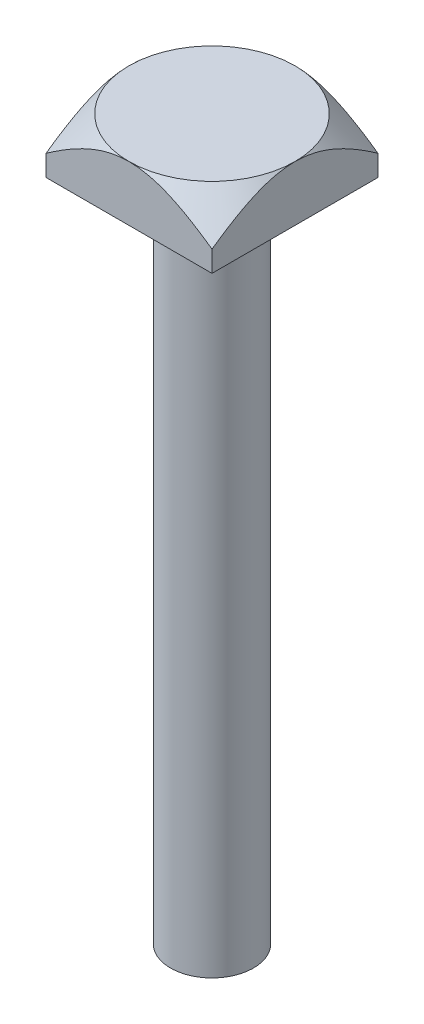
ISO-10303-21;
HEADER;
FILE_DESCRIPTION(('STEP AP214'),'2;1');
FILE_NAME('part.step','',(''),(''),'','','');
FILE_SCHEMA(('AUTOMOTIVE_DESIGN { 1 0 10303 214 1 1 1 1 }'));
ENDSEC;
DATA;
#1=APPLICATION_CONTEXT('core data for automotive mechanical design processes');
#2=APPLICATION_PROTOCOL_DEFINITION('international standard','automotive_design',2000,#1);
#3=PRODUCT_CONTEXT('',#1,'mechanical');
#4=PRODUCT('Part','Part','',(#3));
#5=PRODUCT_RELATED_PRODUCT_CATEGORY('part','',(#4));
#6=PRODUCT_DEFINITION_FORMATION('','',#4);
#7=PRODUCT_DEFINITION_CONTEXT('part definition',#1,'design');
#8=PRODUCT_DEFINITION('design','',#6,#7);
#9=PRODUCT_DEFINITION_SHAPE('','',#8);
#10=(LENGTH_UNIT() NAMED_UNIT(*) SI_UNIT(.MILLI.,.METRE.));
#11=(NAMED_UNIT(*) PLANE_ANGLE_UNIT() SI_UNIT($,.RADIAN.));
#12=(NAMED_UNIT(*) SI_UNIT($,.STERADIAN.) SOLID_ANGLE_UNIT());
#13=UNCERTAINTY_MEASURE_WITH_UNIT(LENGTH_MEASURE(1.E-05),#10,'distance_accuracy_value','');
#14=(GEOMETRIC_REPRESENTATION_CONTEXT(3) GLOBAL_UNCERTAINTY_ASSIGNED_CONTEXT((#13)) GLOBAL_UNIT_ASSIGNED_CONTEXT((#10,
#11,#12)) REPRESENTATION_CONTEXT('',''));
#15=CARTESIAN_POINT('',(0.,0.,0.));
#16=DIRECTION('',(0.,0.,1.));
#17=DIRECTION('',(1.,0.,0.));
#18=AXIS2_PLACEMENT_3D('',#15,#16,#17);
#19=CARTESIAN_POINT('',(12.,8.00000000000012,-12.0000000000002));
#20=DIRECTION('',(-1.,0.,0.));
#21=DIRECTION('',(0.,0.,1.));
#22=AXIS2_PLACEMENT_3D('',#19,#20,#21);
#23=PLANE('',#22);
#24=CARTESIAN_POINT('',(12.,-19.1812739721519,37.2984212813467));
#25=CARTESIAN_POINT('',(12.,-18.5627629114545,36.6486656358265));
#26=CARTESIAN_POINT('',(12.,-17.9450254734401,35.9981717990548));
#27=CARTESIAN_POINT('',(12.,-16.7114099467519,34.6954159558372));
#28=CARTESIAN_POINT('',(12.,-16.0955318698128,34.0431539382812));
#29=CARTESIAN_POINT('',(12.,-14.8657206457217,32.736329127349));
#30=CARTESIAN_POINT('',(12.,-14.2517883293344,32.0817655518025));
#31=CARTESIAN_POINT('',(12.,-13.0265223581445,30.77021205401));
#32=CARTESIAN_POINT('',(12.,-12.4151886982393,30.1132221365329));
#33=CARTESIAN_POINT('',(12.,-11.1887656819335,28.7889257123004));
#34=CARTESIAN_POINT('',(12.,-10.5737117131069,28.1215864138261));
#35=CARTESIAN_POINT('',(12.,-9.3474957620893,26.7833414641541));
#36=CARTESIAN_POINT('',(12.,-8.73633377118265,26.1124358209489));
#37=CARTESIAN_POINT('',(12.,-7.51898164675685,24.7664449918276));
#38=CARTESIAN_POINT('',(12.,-6.91279025143004,24.0913609481095));
#39=CARTESIAN_POINT('',(12.,-5.70645017231661,22.7358155925826));
#40=CARTESIAN_POINT('',(12.,-5.10630143818861,22.0553543256558));
#41=CARTESIAN_POINT('',(12.,-4.07105625484531,20.8680706021514));
#42=CARTESIAN_POINT('',(12.,-3.63418453883629,20.3627969410216));
#43=CARTESIAN_POINT('',(12.,-2.76556538016205,19.3478665203994));
#44=CARTESIAN_POINT('',(12.,-2.33381788605035,18.8382098050011));
#45=CARTESIAN_POINT('',(12.,-1.47633941592013,17.8132551439981));
#46=CARTESIAN_POINT('',(12.,-1.05061278509641,17.297953557375));
#47=CARTESIAN_POINT('',(12.,-0.207082192100009,16.2609110663221));
#48=CARTESIAN_POINT('',(12.,0.210721968042881,15.739170323336));
#49=CARTESIAN_POINT('',(12.,1.03533071759846,14.6889159257799));
#50=CARTESIAN_POINT('',(12.,1.44215761041748,14.1604198222624));
#51=CARTESIAN_POINT('',(12.,2.2428569645836,13.0935370738698));
#52=CARTESIAN_POINT('',(12.,2.63672781843961,12.5551492145167));
#53=CARTESIAN_POINT('',(12.,3.21431301331167,11.7386554398023));
#54=CARTESIAN_POINT('',(12.,3.40454031730682,11.4651532171146));
#55=CARTESIAN_POINT('',(12.,3.77994239368811,10.9147077060796));
#56=CARTESIAN_POINT('',(12.,3.96511733158044,10.6377645308851));
#57=CARTESIAN_POINT('',(12.,4.32952966306028,10.0800878964703));
#58=CARTESIAN_POINT('',(12.,4.50876849161502,9.79935537670839));
#59=CARTESIAN_POINT('',(12.,4.86031303388038,9.23359412121878));
#60=CARTESIAN_POINT('',(12.,5.0326192093632,8.94856567337966));
#61=CARTESIAN_POINT('',(12.,5.32630806967851,8.44674144412769));
#62=CARTESIAN_POINT('',(12.,5.44950596054363,8.23100943203479));
#63=CARTESIAN_POINT('',(12.,5.69071890443423,7.79667352106897));
#64=CARTESIAN_POINT('',(12.,5.80873397279543,7.57806963069629));
#65=CARTESIAN_POINT('',(12.,6.15402918913923,6.91752048325592));
#66=CARTESIAN_POINT('',(12.,6.37252289395979,6.47089925404572));
#67=CARTESIAN_POINT('',(12.,6.77841217286116,5.56539128738989));
#68=CARTESIAN_POINT('',(12.,6.96590895781203,5.10655038618981));
#69=CARTESIAN_POINT('',(12.,7.30195606932974,4.17476260034244));
#70=CARTESIAN_POINT('',(12.,7.45052690700111,3.70182329143847));
#71=CARTESIAN_POINT('',(12.,7.66490988261879,2.87523617724904));
#72=CARTESIAN_POINT('',(12.,7.74224524281219,2.52458411956688));
#73=CARTESIAN_POINT('',(12.,7.86802442929361,1.81810462323864));
#74=CARTESIAN_POINT('',(12.,7.91647303453478,1.46227805063503));
#75=CARTESIAN_POINT('',(12.,7.98193080100035,0.748364005245253));
#76=CARTESIAN_POINT('',(12.,7.99899759504462,0.390281891294811));
#77=CARTESIAN_POINT('',(12.,8.00091626695557,-0.32598079396727));
#78=CARTESIAN_POINT('',(12.,7.98576731555725,-0.68416136757606));
#79=CARTESIAN_POINT('',(12.,7.92419561610344,-1.39667661734302));
#80=CARTESIAN_POINT('',(12.,7.87786862012115,-1.75101970346653));
#81=CARTESIAN_POINT('',(12.,7.75641750434346,-2.45469220771016));
#82=CARTESIAN_POINT('',(12.,7.68129109567725,-2.80402122504073));
#83=CARTESIAN_POINT('',(12.,7.50532009532147,-3.49711086244222));
#84=CARTESIAN_POINT('',(12.,7.4044035542097,-3.84085299519655));
#85=CARTESIAN_POINT('',(12.,7.18062473632253,-4.52101205003485));
#86=CARTESIAN_POINT('',(12.,7.05776357927666,-4.85742934488836));
#87=CARTESIAN_POINT('',(12.,6.74210230584215,-5.65262808025449));
#88=CARTESIAN_POINT('',(12.,6.54070880983129,-6.1079860978865));
#89=CARTESIAN_POINT('',(12.,6.11033067411179,-7.00558097748064));
#90=CARTESIAN_POINT('',(12.,5.88133016315717,-7.44781010785268));
#91=CARTESIAN_POINT('',(12.,5.40160277209869,-8.32146195015965));
#92=CARTESIAN_POINT('',(12.,5.15083053558319,-8.7528595657704));
#93=CARTESIAN_POINT('',(12.,4.63281404272941,-9.60546647465652));
#94=CARTESIAN_POINT('',(12.,4.36557291373857,-10.0266776812481));
#95=CARTESIAN_POINT('',(12.,3.81455880627808,-10.8660012567581));
#96=CARTESIAN_POINT('',(12.,3.53061547251958,-11.2840012658661));
#97=CARTESIAN_POINT('',(12.,2.95218591759066,-12.1126353013767));
#98=CARTESIAN_POINT('',(12.,2.65769932097938,-12.5232690646876));
#99=CARTESIAN_POINT('',(12.,2.06065278764246,-13.3377958424883));
#100=CARTESIAN_POINT('',(12.,1.7581037201065,-13.7416968463823));
#101=CARTESIAN_POINT('',(12.,1.14614768516503,-14.5442460194562));
#102=CARTESIAN_POINT('',(12.,0.83674083903096,-14.9428942813259));
#103=CARTESIAN_POINT('',(12.,0.132118508441443,-15.8375201521696));
#104=CARTESIAN_POINT('',(12.,-0.264732312596434,-16.332208309009));
#105=CARTESIAN_POINT('',(12.,-1.06552270926232,-17.3158225423199));
#106=CARTESIAN_POINT('',(12.,-1.46946249261457,-17.8047484492392));
#107=CARTESIAN_POINT('',(12.,-2.28310500708682,-18.777858932031));
#108=CARTESIAN_POINT('',(12.,-2.69280831826991,-19.2620430222302));
#109=CARTESIAN_POINT('',(12.,-3.51690429630569,-20.2264051610384));
#110=CARTESIAN_POINT('',(12.,-3.93129699898356,-20.7065831789937));
#111=CARTESIAN_POINT('',(12.,-4.76437681199456,-21.6640274841358));
#112=CARTESIAN_POINT('',(12.,-5.18306774918477,-22.1412904385852));
#113=CARTESIAN_POINT('',(12.,-6.02371597926371,-23.0929300124391));
#114=CARTESIAN_POINT('',(12.,-6.44567327903462,-23.5673066257584));
#115=CARTESIAN_POINT('',(12.,-7.71561245140312,-24.9866862419157));
#116=CARTESIAN_POINT('',(12.,-8.56771632140692,-25.9280016336962));
#117=CARTESIAN_POINT('',(12.,-10.2272153194572,-27.7454985411256));
#118=CARTESIAN_POINT('',(12.,-11.0341302524511,-28.6221196714523));
#119=CARTESIAN_POINT('',(12.,-12.6534421564649,-30.3703110240099));
#120=CARTESIAN_POINT('',(12.,-13.4658392286419,-31.2418811524847));
#121=CARTESIAN_POINT('',(12.,-15.0934844795495,-32.9794616233517));
#122=CARTESIAN_POINT('',(12.,-15.90872507995,-33.8454790702756));
#123=CARTESIAN_POINT('',(12.,-17.1341427344101,-35.1420606028314));
#124=CARTESIAN_POINT('',(12.,-17.5430349137125,-35.5738401865867));
#125=CARTESIAN_POINT('',(12.,-18.3615938005283,-36.4366636322799));
#126=CARTESIAN_POINT('',(12.,-18.7712605071205,-36.8677074950916));
#127=CARTESIAN_POINT('',(12.,-19.181273972152,-37.2984212813472));
#128=B_SPLINE_CURVE_WITH_KNOTS('',3,(#24,#25,#26,#27,#28,#29,#30,#31,#32,#33,#34,#35,#36,#37,
#38,#39,#40,#41,#42,#43,#44,#45,#46,#47,#48,#49,#50,#51,#52,#53,#54,#55,#56,#57,#58,#59,#60,#61,
#62,#63,#64,#65,#66,#67,#68,#69,#70,#71,#72,#73,#74,#75,#76,#77,#78,#79,#80,#81,#82,#83,#84,#85,
#86,#87,#88,#89,#90,#91,#92,#93,#94,#95,#96,#97,#98,#99,#100,#101,#102,#103,#104,#105,#106,#107,
#108,#109,#110,#111,#112,#113,#114,#115,#116,#117,#118,#119,#120,#121,#122,#123,#124,#125,#126,
#127),.UNSPECIFIED.,.F.,.F.,(4,2,2,2,2,2,2,2,2,2,2,2,2,2,2,2,2,2,2,2,2,2,2,2,2,2,2,2,2,2,2,2,2,
2,2,2,2,2,2,2,2,2,2,2,2,2,2,2,2,2,2,4),(0.,2.69121753658213,5.3824520225092,8.07471225347135,
10.766967195743,13.4895818426042,16.2121903903646,18.9340849511489,21.6559568170472,
23.6597825184042,25.6635880845819,27.6687727131368,29.6739071690406,31.6746026194041,
33.6755453723181,34.6749551544092,35.6743321582783,36.6734657874191,37.6725327554247,
38.4177588163541,39.1629826720461,40.6536446336058,42.1393388211814,43.6242485758144,
44.7004407098602,45.7764547519093,46.8504907086546,47.9245543124772,48.9953342810784,
50.0661993689603,51.140085210058,52.2139162715074,53.7063601729859,55.1996662077433,
56.6961614908359,58.1923734686014,59.7081308224623,61.2239422055548,62.7378042803498,
64.2516396056672,66.1541471364901,68.0567105089139,69.9594667521988,71.8622375416515,
73.7668819693438,75.6715304111939,79.4805778406645,83.0549314414775,86.6293511778919,
90.1974524870703,91.9814466192954,93.7654386313403),.UNSPECIFIED.);
#129=CARTESIAN_POINT('',(12.,3.02943725152283,11.9999999999998));
#130=VERTEX_POINT('',#129);
#131=CARTESIAN_POINT('',(12.,8.00000000000001,-2.22044604925031E-13));
#132=VERTEX_POINT('',#131);
#133=EDGE_CURVE('E243',#130,#132,#128,.T.);
#134=ORIENTED_EDGE('',*,*,#133,.F.);
#135=DIRECTION('',(0.,-1.,0.));
#136=VECTOR('',#135,1.);
#137=CARTESIAN_POINT('',(12.,8.00000000000001,11.9999999999998));
#138=LINE('',#137,#136);
#139=CARTESIAN_POINT('',(12.,0.,12.));
#140=VERTEX_POINT('',#139);
#141=EDGE_CURVE('E313',#130,#140,#138,.T.);
#142=ORIENTED_EDGE('',*,*,#141,.T.);
#143=DIRECTION('',(0.,0.,-1.));
#144=VECTOR('',#143,1.);
#145=CARTESIAN_POINT('',(12.,1.11022302462516E-13,-12.));
#146=LINE('',#145,#144);
#147=CARTESIAN_POINT('',(12.,1.11022302462516E-13,-12.));
#148=VERTEX_POINT('',#147);
#149=EDGE_CURVE('E246',#140,#148,#146,.T.);
#150=ORIENTED_EDGE('',*,*,#149,.T.);
#151=DIRECTION('',(0.,-1.,0.));
#152=VECTOR('',#151,1.);
#153=CARTESIAN_POINT('',(12.,8.00000000000012,-12.0000000000002));
#154=LINE('',#153,#152);
#155=CARTESIAN_POINT('',(12.,3.02943725152294,-12.0000000000002));
#156=VERTEX_POINT('',#155);
#157=EDGE_CURVE('E255',#156,#148,#154,.T.);
#158=ORIENTED_EDGE('',*,*,#157,.F.);
#159=EDGE_CURVE('E232',#132,#156,#128,.T.);
#160=ORIENTED_EDGE('',*,*,#159,.F.);
#161=EDGE_LOOP('',(#134,#142,#150,#158,#160));
#162=FACE_BOUND('',#161,.T.);
#163=ADVANCED_FACE('F170',(#162),#23,.F.);
#164=CARTESIAN_POINT('',(-12.,8.00000000000012,-12.0000000000002));
#165=DIRECTION('',(0.,0.,1.));
#166=DIRECTION('',(1.,0.,0.));
#167=AXIS2_PLACEMENT_3D('',#164,#165,#166);
#168=PLANE('',#167);
#169=CARTESIAN_POINT('',(37.2984212813471,-19.1812739721519,-12.0000000000002));
#170=CARTESIAN_POINT('',(36.6486656358267,-18.5627629114545,-12.0000000000002));
#171=CARTESIAN_POINT('',(35.9981717990551,-17.9450254734401,-12.0000000000002));
#172=CARTESIAN_POINT('',(34.6954159558375,-16.7114099467519,-12.0000000000002));
#173=CARTESIAN_POINT('',(34.0431539382814,-16.0955318698129,-12.0000000000002));
#174=CARTESIAN_POINT('',(32.7363291273492,-14.8657206457217,-12.0000000000002));
#175=CARTESIAN_POINT('',(32.0817655518027,-14.2517883293344,-12.0000000000002));
#176=CARTESIAN_POINT('',(30.7702120540102,-13.0265223581445,-12.0000000000002));
#177=CARTESIAN_POINT('',(30.1132221365331,-12.4151886982393,-12.0000000000002));
#178=CARTESIAN_POINT('',(28.7889257123006,-11.1887656819334,-12.0000000000002));
#179=CARTESIAN_POINT('',(28.1215864138262,-10.5737117131069,-12.0000000000002));
#180=CARTESIAN_POINT('',(26.7833414641542,-9.34749576208923,-12.0000000000002));
#181=CARTESIAN_POINT('',(26.112435820949,-8.73633377118259,-12.0000000000002));
#182=CARTESIAN_POINT('',(24.7664449918277,-7.51898164675674,-12.0000000000003));
#183=CARTESIAN_POINT('',(24.0913609481096,-6.91279025142987,-12.0000000000003));
#184=CARTESIAN_POINT('',(22.7358155925826,-5.70645017231652,-12.0000000000002));
#185=CARTESIAN_POINT('',(22.0553543256557,-5.10630143818865,-12.));
#186=CARTESIAN_POINT('',(20.8680706021514,-4.0710562548453,-12.));
#187=CARTESIAN_POINT('',(20.3627969410216,-3.63418453883618,-12.0000000000002));
#188=CARTESIAN_POINT('',(19.3478665203995,-2.76556538016187,-12.0000000000003));
#189=CARTESIAN_POINT('',(18.8382098050012,-2.33381788605021,-12.0000000000002));
#190=CARTESIAN_POINT('',(17.8132551439982,-1.47633941592002,-12.0000000000002));
#191=CARTESIAN_POINT('',(17.2979535573751,-1.05061278509629,-12.0000000000002));
#192=CARTESIAN_POINT('',(16.2609110663222,-0.207082192099905,-12.0000000000002));
#193=CARTESIAN_POINT('',(15.7391703233361,0.210721968042979,-12.0000000000002));
#194=CARTESIAN_POINT('',(14.68891592578,1.03533071759854,-12.0000000000002));
#195=CARTESIAN_POINT('',(14.1604198222625,1.44215761041755,-12.0000000000002));
#196=CARTESIAN_POINT('',(13.0935370738699,2.24285696458365,-12.0000000000002));
#197=CARTESIAN_POINT('',(12.5551492145169,2.63672781843966,-12.0000000000002));
#198=CARTESIAN_POINT('',(11.7386554398025,3.21431301331171,-12.0000000000002));
#199=CARTESIAN_POINT('',(11.4651532171148,3.40454031730685,-12.0000000000002));
#200=CARTESIAN_POINT('',(10.9147077060798,3.77994239368814,-12.0000000000002));
#201=CARTESIAN_POINT('',(10.6377645308853,3.96511733158047,-12.0000000000002));
#202=CARTESIAN_POINT('',(10.0800878964705,4.3295296630603,-12.0000000000002));
#203=CARTESIAN_POINT('',(9.79935537670859,4.50876849161503,-12.0000000000002));
#204=CARTESIAN_POINT('',(9.23359412121899,4.86031303388038,-12.0000000000002));
#205=CARTESIAN_POINT('',(8.94856567337988,5.0326192093632,-12.0000000000002));
#206=CARTESIAN_POINT('',(8.44674144412792,5.32630806967851,-12.0000000000002));
#207=CARTESIAN_POINT('',(8.23100943203501,5.44950596054363,-12.0000000000002));
#208=CARTESIAN_POINT('',(7.79667352106919,5.69071890443423,-12.0000000000002));
#209=CARTESIAN_POINT('',(7.57806963069652,5.80873397279543,-12.0000000000002));
#210=CARTESIAN_POINT('',(6.91752048325615,6.15402918913922,-12.0000000000002));
#211=CARTESIAN_POINT('',(6.47089925404596,6.37252289395979,-12.0000000000002));
#212=CARTESIAN_POINT('',(5.56539128739013,6.77841217286115,-12.0000000000002));
#213=CARTESIAN_POINT('',(5.10655038619004,6.96590895781203,-12.0000000000002));
#214=CARTESIAN_POINT('',(4.17476260034267,7.30195606932974,-12.0000000000002));
#215=CARTESIAN_POINT('',(3.7018232914387,7.45052690700111,-12.0000000000002));
#216=CARTESIAN_POINT('',(2.87523617724925,7.66490988261879,-12.0000000000002));
#217=CARTESIAN_POINT('',(2.52458411956708,7.74224524281219,-12.0000000000002));
#218=CARTESIAN_POINT('',(1.81810462323882,7.86802442929362,-12.0000000000002));
#219=CARTESIAN_POINT('',(1.46227805063521,7.9164730345348,-12.0000000000002));
#220=CARTESIAN_POINT('',(0.748364005245403,7.98193080100035,-12.0000000000002));
#221=CARTESIAN_POINT('',(0.390281891294952,7.99899759504459,-12.0000000000002));
#222=CARTESIAN_POINT('',(-0.325980793967148,8.0009162669556,-12.0000000000002));
#223=CARTESIAN_POINT('',(-0.684161367575947,7.98576731555737,-12.0000000000002));
#224=CARTESIAN_POINT('',(-1.39667661734289,7.92419561610355,-12.0000000000002));
#225=CARTESIAN_POINT('',(-1.75101970346636,7.87786862012117,-12.0000000000002));
#226=CARTESIAN_POINT('',(-2.45469220770994,7.75641750434342,-12.0000000000002));
#227=CARTESIAN_POINT('',(-2.80402122504049,7.68129109567725,-12.0000000000002));
#228=CARTESIAN_POINT('',(-3.49711086244195,7.50532009532149,-12.0000000000002));
#229=CARTESIAN_POINT('',(-3.84085299519626,7.4044035542097,-12.0000000000002));
#230=CARTESIAN_POINT('',(-4.52101205003454,7.18062473632258,-12.0000000000002));
#231=CARTESIAN_POINT('',(-4.85742934488804,7.05776357927676,-12.0000000000002));
#232=CARTESIAN_POINT('',(-5.65262808025416,6.74210230584228,-12.0000000000002));
#233=CARTESIAN_POINT('',(-6.10798609788615,6.54070880983137,-12.0000000000002));
#234=CARTESIAN_POINT('',(-7.00558097748027,6.11033067411184,-12.0000000000002));
#235=CARTESIAN_POINT('',(-7.44781010785232,5.88133016315724,-12.0000000000002));
#236=CARTESIAN_POINT('',(-8.3214619501593,5.40160277209876,-12.0000000000002));
#237=CARTESIAN_POINT('',(-8.75285956577006,5.15083053558326,-12.0000000000002));
#238=CARTESIAN_POINT('',(-9.60546647465619,4.63281404272947,-12.0000000000002));
#239=CARTESIAN_POINT('',(-10.0266776812478,4.36557291373863,-12.0000000000002));
#240=CARTESIAN_POINT('',(-10.8660012567578,3.81455880627815,-12.0000000000002));
#241=CARTESIAN_POINT('',(-11.2840012658658,3.53061547251964,-12.0000000000002));
#242=CARTESIAN_POINT('',(-12.1126353013764,2.95218591759073,-12.0000000000002));
#243=CARTESIAN_POINT('',(-12.5232690646873,2.65769932097946,-12.0000000000002));
#244=CARTESIAN_POINT('',(-13.3377958424879,2.06065278764252,-12.0000000000002));
#245=CARTESIAN_POINT('',(-13.741696846382,1.75810372010654,-12.0000000000003));
#246=CARTESIAN_POINT('',(-14.5442460194559,1.14614768516514,-12.0000000000002));
#247=CARTESIAN_POINT('',(-14.9428942813257,0.836740839031167,-12.));
#248=CARTESIAN_POINT('',(-15.8375201521694,0.132118508441685,-12.));
#249=CARTESIAN_POINT('',(-16.3322083090087,-0.2647323125963,-12.0000000000002));
#250=CARTESIAN_POINT('',(-17.3158225423196,-1.06552270926226,-12.0000000000003));
#251=CARTESIAN_POINT('',(-17.8047484492388,-1.46946249261448,-12.0000000000003));
#252=CARTESIAN_POINT('',(-18.7778589320306,-2.28310500708669,-12.0000000000002));
#253=CARTESIAN_POINT('',(-19.2620430222298,-2.69280831826979,-12.0000000000002));
#254=CARTESIAN_POINT('',(-20.226405161038,-3.51690429630556,-12.0000000000002));
#255=CARTESIAN_POINT('',(-20.7065831789933,-3.93129699898343,-12.0000000000002));
#256=CARTESIAN_POINT('',(-21.6640274841354,-4.76437681199443,-12.0000000000002));
#257=CARTESIAN_POINT('',(-22.1412904385848,-5.18306774918464,-12.0000000000002));
#258=CARTESIAN_POINT('',(-23.0929300124387,-6.02371597926357,-12.0000000000002));
#259=CARTESIAN_POINT('',(-23.567306625758,-6.44567327903449,-12.0000000000002));
#260=CARTESIAN_POINT('',(-24.9866862419154,-7.71561245140299,-12.0000000000002));
#261=CARTESIAN_POINT('',(-25.9280016336958,-8.56771632140678,-12.0000000000002));
#262=CARTESIAN_POINT('',(-27.7454985411253,-10.2272153194571,-12.0000000000002));
#263=CARTESIAN_POINT('',(-28.6221196714519,-11.034130252451,-12.0000000000002));
#264=CARTESIAN_POINT('',(-30.3703110240096,-12.6534421564649,-12.0000000000002));
#265=CARTESIAN_POINT('',(-31.2418811524844,-13.4658392286418,-12.0000000000002));
#266=CARTESIAN_POINT('',(-32.9794616233514,-15.0934844795495,-12.0000000000002));
#267=CARTESIAN_POINT('',(-33.8454790702753,-15.90872507995,-12.0000000000002));
#268=CARTESIAN_POINT('',(-35.1420606028311,-17.1341427344101,-12.0000000000002));
#269=CARTESIAN_POINT('',(-35.5738401865865,-17.5430349137125,-12.0000000000002));
#270=CARTESIAN_POINT('',(-36.4366636322797,-18.3615938005283,-12.0000000000002));
#271=CARTESIAN_POINT('',(-36.8677074950914,-18.7712605071205,-12.0000000000002));
#272=CARTESIAN_POINT('',(-37.2984212813471,-19.1812739721519,-12.0000000000002));
#273=B_SPLINE_CURVE_WITH_KNOTS('',3,(#169,#170,#171,#172,#173,#174,#175,#176,#177,#178,#179,
#180,#181,#182,#183,#184,#185,#186,#187,#188,#189,#190,#191,#192,#193,#194,#195,#196,#197,#198,
#199,#200,#201,#202,#203,#204,#205,#206,#207,#208,#209,#210,#211,#212,#213,#214,#215,#216,#217,
#218,#219,#220,#221,#222,#223,#224,#225,#226,#227,#228,#229,#230,#231,#232,#233,#234,#235,#236,
#237,#238,#239,#240,#241,#242,#243,#244,#245,#246,#247,#248,#249,#250,#251,#252,#253,#254,#255,
#256,#257,#258,#259,#260,#261,#262,#263,#264,#265,#266,#267,#268,#269,#270,#271,#272),
.UNSPECIFIED.,.F.,.F.,(4,2,2,2,2,2,2,2,2,2,2,2,2,2,2,2,2,2,2,2,2,2,2,2,2,2,2,2,2,2,2,2,2,2,2,2,
2,2,2,2,2,2,2,2,2,2,2,2,2,2,2,4),(0.,2.69121753658217,5.38245202250926,8.07471225347145,
10.7669671957431,13.4895818426043,16.2121903903648,18.9340849511492,21.6559568170475,
23.6597825184045,25.6635880845822,27.668772713137,29.6739071690408,31.6746026194043,
33.6755453723182,34.6749551544094,35.6743321582784,36.6734657874192,37.6725327554248,
38.4177588163541,39.1629826720461,40.6536446336059,42.1393388211815,43.6242485758145,
44.7004407098604,45.7764547519095,46.8504907086548,47.9245543124774,48.9953342810785,
50.0661993689604,51.1400852100581,52.2139162715073,53.7063601729858,55.1996662077432,
56.6961614908358,58.1923734686014,59.7081308224622,61.2239422055548,62.7378042803497,
64.2516396056672,66.15414713649,68.0567105089138,69.9594667521987,71.8622375416515,
73.7668819693437,75.6715304111939,79.4805778406644,83.0549314414775,86.6293511778919,
90.1974524870703,91.9814466192955,93.7654386313405),.UNSPECIFIED.);
#274=CARTESIAN_POINT('',(0.,8.00000000000012,-12.0000000000002));
#275=VERTEX_POINT('',#274);
#276=EDGE_CURVE('E231',#156,#275,#273,.T.);
#277=ORIENTED_EDGE('',*,*,#276,.F.);
#278=ORIENTED_EDGE('',*,*,#157,.T.);
#279=DIRECTION('',(-1.,0.,0.));
#280=VECTOR('',#279,1.);
#281=CARTESIAN_POINT('',(-12.,1.11022302462516E-13,-12.));
#282=LINE('',#281,#280);
#283=CARTESIAN_POINT('',(-12.,1.11022302462516E-13,-12.));
#284=VERTEX_POINT('',#283);
#285=EDGE_CURVE('E291',#148,#284,#282,.T.);
#286=ORIENTED_EDGE('',*,*,#285,.T.);
#287=DIRECTION('',(0.,-1.,0.));
#288=VECTOR('',#287,1.);
#289=CARTESIAN_POINT('',(-12.,8.00000000000012,-12.0000000000002));
#290=LINE('',#289,#288);
#291=CARTESIAN_POINT('',(-12.,3.02943725152294,-12.0000000000002));
#292=VERTEX_POINT('',#291);
#293=EDGE_CURVE('E320',#292,#284,#290,.T.);
#294=ORIENTED_EDGE('',*,*,#293,.F.);
#295=EDGE_CURVE('E341',#275,#292,#273,.T.);
#296=ORIENTED_EDGE('',*,*,#295,.F.);
#297=EDGE_LOOP('',(#277,#278,#286,#294,#296));
#298=FACE_BOUND('',#297,.T.);
#299=ADVANCED_FACE('F333',(#298),#168,.F.);
#300=CARTESIAN_POINT('',(-12.,8.00000000000012,-12.0000000000002));
#301=DIRECTION('',(1.,0.,0.));
#302=DIRECTION('',(0.,0.,-1.));
#303=AXIS2_PLACEMENT_3D('',#300,#301,#302);
#304=PLANE('',#303);
#305=CARTESIAN_POINT('',(-12.,-19.181273972152,-37.2984212813472));
#306=CARTESIAN_POINT('',(-12.,-18.5627629114545,-36.6486656358269));
#307=CARTESIAN_POINT('',(-12.,-17.9450254734401,-35.9981717990553));
#308=CARTESIAN_POINT('',(-12.,-16.7114099467519,-34.6954159558377));
#309=CARTESIAN_POINT('',(-12.,-16.0955318698129,-34.0431539382816));
#310=CARTESIAN_POINT('',(-12.,-14.8657206457217,-32.7363291273495));
#311=CARTESIAN_POINT('',(-12.,-14.2517883293345,-32.081765551803));
#312=CARTESIAN_POINT('',(-12.,-13.0265223581445,-30.7702120540105));
#313=CARTESIAN_POINT('',(-12.,-12.4151886982393,-30.1132221365334));
#314=CARTESIAN_POINT('',(-12.,-11.1887656819335,-28.7889257123008));
#315=CARTESIAN_POINT('',(-12.,-10.5737117131069,-28.1215864138265));
#316=CARTESIAN_POINT('',(-12.,-9.34749576208925,-26.7833414641545));
#317=CARTESIAN_POINT('',(-12.,-8.73633377118261,-26.1124358209493));
#318=CARTESIAN_POINT('',(-12.,-7.51898164675673,-24.7664449918279));
#319=CARTESIAN_POINT('',(-12.,-6.91279025142984,-24.0913609481099));
#320=CARTESIAN_POINT('',(-12.,-5.70645017231656,-22.7358155925828));
#321=CARTESIAN_POINT('',(-12.,-5.10630143818878,-22.0553543256558));
#322=CARTESIAN_POINT('',(-12.,-4.0710562548454,-20.8680706021515));
#323=CARTESIAN_POINT('',(-12.,-3.63418453883619,-20.3627969410218));
#324=CARTESIAN_POINT('',(-12.,-2.76556538016183,-19.3478665203998));
#325=CARTESIAN_POINT('',(-12.,-2.33381788605019,-18.8382098050014));
#326=CARTESIAN_POINT('',(-12.,-1.47633941592001,-17.8132551439984));
#327=CARTESIAN_POINT('',(-12.,-1.05061278509628,-17.2979535573753));
#328=CARTESIAN_POINT('',(-12.,-0.20708219209988,-16.2609110663224));
#329=CARTESIAN_POINT('',(-12.,0.210721968043002,-15.7391703233363));
#330=CARTESIAN_POINT('',(-12.,1.03533071759856,-14.6889159257802));
#331=CARTESIAN_POINT('',(-12.,1.44215761041757,-14.1604198222627));
#332=CARTESIAN_POINT('',(-12.,2.24285696458367,-13.0935370738701));
#333=CARTESIAN_POINT('',(-12.,2.63672781843967,-12.5551492145171));
#334=CARTESIAN_POINT('',(-12.,3.21431301331172,-11.7386554398027));
#335=CARTESIAN_POINT('',(-12.,3.40454031730686,-11.465153217115));
#336=CARTESIAN_POINT('',(-12.,3.77994239368814,-10.91470770608));
#337=CARTESIAN_POINT('',(-12.,3.96511733158047,-10.6377645308855));
#338=CARTESIAN_POINT('',(-12.,4.3295296630603,-10.0800878964707));
#339=CARTESIAN_POINT('',(-12.,4.50876849161503,-9.79935537670881));
#340=CARTESIAN_POINT('',(-12.,4.86031303388038,-9.23359412121922));
#341=CARTESIAN_POINT('',(-12.,5.0326192093632,-8.9485656733801));
#342=CARTESIAN_POINT('',(-12.,5.32630806967851,-8.44674144412814));
#343=CARTESIAN_POINT('',(-12.,5.44950596054363,-8.23100943203524));
#344=CARTESIAN_POINT('',(-12.,5.69071890443422,-7.79667352106942));
#345=CARTESIAN_POINT('',(-12.,5.80873397279543,-7.57806963069675));
#346=CARTESIAN_POINT('',(-12.,6.15402918913921,-6.91752048325639));
#347=CARTESIAN_POINT('',(-12.,6.37252289395977,-6.4708992540462));
#348=CARTESIAN_POINT('',(-12.,6.77841217286115,-5.56539128739037));
#349=CARTESIAN_POINT('',(-12.,6.96590895781205,-5.1065503861903));
#350=CARTESIAN_POINT('',(-12.,7.3019560693297,-4.17476260034291));
#351=CARTESIAN_POINT('',(-12.,7.45052690700098,-3.70182329143892));
#352=CARTESIAN_POINT('',(-12.,7.66490988261869,-2.87523617724948));
#353=CARTESIAN_POINT('',(-12.,7.74224524281216,-2.52458411956734));
#354=CARTESIAN_POINT('',(-12.,7.86802442929363,-1.8181046232391));
#355=CARTESIAN_POINT('',(-12.,7.9164730345348,-1.46227805063549));
#356=CARTESIAN_POINT('',(-12.,7.98193080100033,-0.748364005245697));
#357=CARTESIAN_POINT('',(-12.,7.99899759504459,-0.390281891295257));
#358=CARTESIAN_POINT('',(-12.,8.00091626695561,0.325980793966826));
#359=CARTESIAN_POINT('',(-12.,7.98576731555736,0.68416136757562));
#360=CARTESIAN_POINT('',(-12.,7.92419561610356,1.39667661734257));
#361=CARTESIAN_POINT('',(-12.,7.87786862012118,1.75101970346606));
#362=CARTESIAN_POINT('',(-12.,7.75641750434344,2.45469220770967));
#363=CARTESIAN_POINT('',(-12.,7.68129109567726,2.80402122504024));
#364=CARTESIAN_POINT('',(-12.,7.50532009532149,3.49711086244173));
#365=CARTESIAN_POINT('',(-12.,7.40440355420969,3.84085299519606));
#366=CARTESIAN_POINT('',(-12.,7.18062473632256,4.52101205003438));
#367=CARTESIAN_POINT('',(-12.,7.05776357927676,4.85742934488792));
#368=CARTESIAN_POINT('',(-12.,6.74210230584228,5.65262808025405));
#369=CARTESIAN_POINT('',(-12.,6.54070880983133,6.10798609788604));
#370=CARTESIAN_POINT('',(-12.,6.11033067411177,7.00558097748015));
#371=CARTESIAN_POINT('',(-12.,5.88133016315718,7.44781010785221));
#372=CARTESIAN_POINT('',(-12.,5.4016027720987,8.3214619501592));
#373=CARTESIAN_POINT('',(-12.,5.15083053558318,8.75285956576996));
#374=CARTESIAN_POINT('',(-12.,4.63281404272939,9.6054664746561));
#375=CARTESIAN_POINT('',(-12.,4.36557291373855,10.0266776812477));
#376=CARTESIAN_POINT('',(-12.,3.81455880627805,10.8660012567577));
#377=CARTESIAN_POINT('',(-12.,3.53061547251954,11.2840012658657));
#378=CARTESIAN_POINT('',(-12.,2.95218591759062,12.1126353013763));
#379=CARTESIAN_POINT('',(-12.,2.65769932097934,12.5232690646872));
#380=CARTESIAN_POINT('',(-12.,2.06065278764239,13.3377958424879));
#381=CARTESIAN_POINT('',(-12.,1.7581037201064,13.7416968463819));
#382=CARTESIAN_POINT('',(-12.,1.14614768516501,14.5442460194559));
#383=CARTESIAN_POINT('',(-12.,0.836740839031059,14.9428942813257));
#384=CARTESIAN_POINT('',(-12.,0.132118508441586,15.8375201521694));
#385=CARTESIAN_POINT('',(-12.,-0.26473231259642,16.3322083090086));
#386=CARTESIAN_POINT('',(-12.,-1.06552270926239,17.3158225423195));
#387=CARTESIAN_POINT('',(-12.,-1.4694624926146,17.8047484492388));
#388=CARTESIAN_POINT('',(-12.,-2.2831050070868,18.7778589320305));
#389=CARTESIAN_POINT('',(-12.,-2.6928083182699,19.2620430222297));
#390=CARTESIAN_POINT('',(-12.,-3.51690429630567,20.2264051610379));
#391=CARTESIAN_POINT('',(-12.,-3.93129699898353,20.7065831789932));
#392=CARTESIAN_POINT('',(-12.,-4.76437681199451,21.6640274841353));
#393=CARTESIAN_POINT('',(-12.,-5.18306774918471,22.1412904385847));
#394=CARTESIAN_POINT('',(-12.,-6.02371597926364,23.0929300124386));
#395=CARTESIAN_POINT('',(-12.,-6.44567327903456,23.5673066257579));
#396=CARTESIAN_POINT('',(-12.,-7.71561245140304,24.9866862419152));
#397=CARTESIAN_POINT('',(-12.,-8.56771632140682,25.9280016336957));
#398=CARTESIAN_POINT('',(-12.,-10.2272153194571,27.7454985411251));
#399=CARTESIAN_POINT('',(-12.,-11.034130252451,28.6221196714517));
#400=CARTESIAN_POINT('',(-12.,-12.6534421564649,30.3703110240094));
#401=CARTESIAN_POINT('',(-12.,-13.4658392286418,31.2418811524842));
#402=CARTESIAN_POINT('',(-12.,-15.0934844795495,32.9794616233511));
#403=CARTESIAN_POINT('',(-12.,-15.9087250799499,33.8454790702751));
#404=CARTESIAN_POINT('',(-12.,-17.13414273441,35.1420606028309));
#405=CARTESIAN_POINT('',(-12.,-17.5430349137125,35.5738401865862));
#406=CARTESIAN_POINT('',(-12.,-18.3615938005282,36.4366636322794));
#407=CARTESIAN_POINT('',(-12.,-18.7712605071205,36.8677074950911));
#408=CARTESIAN_POINT('',(-12.,-19.1812739721519,37.2984212813467));
#409=B_SPLINE_CURVE_WITH_KNOTS('',3,(#305,#306,#307,#308,#309,#310,#311,#312,#313,#314,#315,
#316,#317,#318,#319,#320,#321,#322,#323,#324,#325,#326,#327,#328,#329,#330,#331,#332,#333,#334,
#335,#336,#337,#338,#339,#340,#341,#342,#343,#344,#345,#346,#347,#348,#349,#350,#351,#352,#353,
#354,#355,#356,#357,#358,#359,#360,#361,#362,#363,#364,#365,#366,#367,#368,#369,#370,#371,#372,
#373,#374,#375,#376,#377,#378,#379,#380,#381,#382,#383,#384,#385,#386,#387,#388,#389,#390,#391,
#392,#393,#394,#395,#396,#397,#398,#399,#400,#401,#402,#403,#404,#405,#406,#407,#408),
.UNSPECIFIED.,.F.,.F.,(4,2,2,2,2,2,2,2,2,2,2,2,2,2,2,2,2,2,2,2,2,2,2,2,2,2,2,2,2,2,2,2,2,2,2,2,
2,2,2,2,2,2,2,2,2,2,2,2,2,2,2,4),(0.,2.69121753658215,5.38245202250923,8.07471225347141,
10.766967195743,13.4895818426043,16.2121903903648,18.9340849511492,21.6559568170475,
23.6597825184045,25.6635880845822,27.668772713137,29.6739071690408,31.6746026194043,
33.6755453723182,34.6749551544094,35.6743321582784,36.6734657874192,37.6725327554248,
38.4177588163541,39.1629826720461,40.6536446336059,42.1393388211815,43.6242485758144,
44.7004407098603,45.7764547519094,46.8504907086547,47.9245543124773,48.9953342810784,
50.0661993689603,51.1400852100581,52.2139162715074,53.7063601729859,55.1996662077433,
56.6961614908359,58.1923734686016,59.7081308224624,61.223942205555,62.7378042803499,
64.2516396056674,66.1541471364902,68.0567105089139,69.9594667521988,71.8622375416516,
73.7668819693437,75.6715304111939,79.4805778406644,83.0549314414775,86.6293511778919,
90.1974524870703,91.9814466192954,93.7654386313403),.UNSPECIFIED.);
#410=CARTESIAN_POINT('',(-12.,8.00000000000001,-2.22044604925031E-13));
#411=VERTEX_POINT('',#410);
#412=EDGE_CURVE('E261',#292,#411,#409,.T.);
#413=ORIENTED_EDGE('',*,*,#412,.F.);
#414=ORIENTED_EDGE('',*,*,#293,.T.);
#415=DIRECTION('',(0.,0.,1.));
#416=VECTOR('',#415,1.);
#417=CARTESIAN_POINT('',(-12.,1.11022302462516E-13,-12.));
#418=LINE('',#417,#416);
#419=CARTESIAN_POINT('',(-12.,0.,12.));
#420=VERTEX_POINT('',#419);
#421=EDGE_CURVE('E299',#284,#420,#418,.T.);
#422=ORIENTED_EDGE('',*,*,#421,.T.);
#423=DIRECTION('',(0.,-1.,0.));
#424=VECTOR('',#423,1.);
#425=CARTESIAN_POINT('',(-12.,8.00000000000001,11.9999999999998));
#426=LINE('',#425,#424);
#427=CARTESIAN_POINT('',(-12.,3.02943725152283,11.9999999999998));
#428=VERTEX_POINT('',#427);
#429=EDGE_CURVE('E314',#428,#420,#426,.T.);
#430=ORIENTED_EDGE('',*,*,#429,.F.);
#431=EDGE_CURVE('E256',#411,#428,#409,.T.);
#432=ORIENTED_EDGE('',*,*,#431,.F.);
#433=EDGE_LOOP('',(#413,#414,#422,#430,#432));
#434=FACE_BOUND('',#433,.T.);
#435=ADVANCED_FACE('F334',(#434),#304,.F.);
#436=CARTESIAN_POINT('',(-12.,8.00000000000001,11.9999999999998));
#437=DIRECTION('',(0.,0.,-1.));
#438=DIRECTION('',(-1.,0.,0.));
#439=AXIS2_PLACEMENT_3D('',#436,#437,#438);
#440=PLANE('',#439);
#441=CARTESIAN_POINT('',(-37.2984212813471,-19.181273972152,11.9999999999998));
#442=CARTESIAN_POINT('',(-36.6486656358268,-18.5627629114546,11.9999999999998));
#443=CARTESIAN_POINT('',(-35.9981717990551,-17.9450254734402,11.9999999999998));
#444=CARTESIAN_POINT('',(-34.6954159558375,-16.711409946752,11.9999999999998));
#445=CARTESIAN_POINT('',(-34.0431539382815,-16.0955318698129,11.9999999999998));
#446=CARTESIAN_POINT('',(-32.7363291273493,-14.8657206457218,11.9999999999998));
#447=CARTESIAN_POINT('',(-32.0817655518028,-14.2517883293345,11.9999999999998));
#448=CARTESIAN_POINT('',(-30.7702120540103,-13.0265223581445,11.9999999999998));
#449=CARTESIAN_POINT('',(-30.1132221365332,-12.4151886982394,11.9999999999998));
#450=CARTESIAN_POINT('',(-28.7889257123006,-11.1887656819335,11.9999999999998));
#451=CARTESIAN_POINT('',(-28.1215864138263,-10.5737117131069,11.9999999999998));
#452=CARTESIAN_POINT('',(-26.7833414641543,-9.34749576208929,11.9999999999998));
#453=CARTESIAN_POINT('',(-26.1124358209491,-8.73633377118265,11.9999999999998));
#454=CARTESIAN_POINT('',(-24.7664449918277,-7.51898164675678,11.9999999999998));
#455=CARTESIAN_POINT('',(-24.0913609481097,-6.9127902514299,11.9999999999997));
#456=CARTESIAN_POINT('',(-22.7358155925827,-5.70645017231659,11.9999999999999));
#457=CARTESIAN_POINT('',(-22.0553543256557,-5.10630143818877,12.));
#458=CARTESIAN_POINT('',(-20.8680706021514,-4.0710562548454,12.));
#459=CARTESIAN_POINT('',(-20.3627969410216,-3.63418453883623,11.9999999999998));
#460=CARTESIAN_POINT('',(-19.3478665203996,-2.76556538016188,11.9999999999997));
#461=CARTESIAN_POINT('',(-18.8382098050012,-2.33381788605022,11.9999999999998));
#462=CARTESIAN_POINT('',(-17.8132551439982,-1.47633941592003,11.9999999999998));
#463=CARTESIAN_POINT('',(-17.2979535573751,-1.0506127850963,11.9999999999998));
#464=CARTESIAN_POINT('',(-16.2609110663222,-0.2070821920999,11.9999999999998));
#465=CARTESIAN_POINT('',(-15.7391703233361,0.210721968042987,11.9999999999998));
#466=CARTESIAN_POINT('',(-14.68891592578,1.03533071759855,11.9999999999998));
#467=CARTESIAN_POINT('',(-14.1604198222625,1.44215761041757,11.9999999999998));
#468=CARTESIAN_POINT('',(-13.0935370738699,2.24285696458367,11.9999999999998));
#469=CARTESIAN_POINT('',(-12.5551492145168,2.63672781843968,11.9999999999998));
#470=CARTESIAN_POINT('',(-11.7386554398025,3.21431301331174,11.9999999999998));
#471=CARTESIAN_POINT('',(-11.4651532171147,3.40454031730688,11.9999999999998));
#472=CARTESIAN_POINT('',(-10.9147077060797,3.77994239368817,11.9999999999998));
#473=CARTESIAN_POINT('',(-10.6377645308853,3.96511733158049,11.9999999999998));
#474=CARTESIAN_POINT('',(-10.0800878964704,4.32952966306034,11.9999999999998));
#475=CARTESIAN_POINT('',(-9.79935537670854,4.50876849161508,11.9999999999998));
#476=CARTESIAN_POINT('',(-9.23359412121891,4.86031303388041,11.9999999999998));
#477=CARTESIAN_POINT('',(-8.94856567337977,5.03261920936319,11.9999999999998));
#478=CARTESIAN_POINT('',(-8.44674144412781,5.32630806967852,11.9999999999998));
#479=CARTESIAN_POINT('',(-8.23100943203493,5.44950596054367,11.9999999999998));
#480=CARTESIAN_POINT('',(-7.79667352106913,5.69071890443428,11.9999999999998));
#481=CARTESIAN_POINT('',(-7.57806963069645,5.80873397279547,11.9999999999998));
#482=CARTESIAN_POINT('',(-6.9175204832561,6.15402918913924,11.9999999999998));
#483=CARTESIAN_POINT('',(-6.47089925404591,6.37252289395979,11.9999999999998));
#484=CARTESIAN_POINT('',(-5.56539128739011,6.77841217286117,11.9999999999998));
#485=CARTESIAN_POINT('',(-5.10655038619005,6.96590895781206,11.9999999999998));
#486=CARTESIAN_POINT('',(-4.17476260034268,7.3019560693297,11.9999999999998));
#487=CARTESIAN_POINT('',(-3.70182329143869,7.45052690700098,11.9999999999998));
#488=CARTESIAN_POINT('',(-2.87523617724925,7.6649098826187,11.9999999999998));
#489=CARTESIAN_POINT('',(-2.52458411956709,7.74224524281216,11.9999999999998));
#490=CARTESIAN_POINT('',(-1.81810462323884,7.86802442929364,11.9999999999998));
#491=CARTESIAN_POINT('',(-1.46227805063522,7.9164730345348,11.9999999999998));
#492=CARTESIAN_POINT('',(-0.748364005245417,7.98193080100035,11.9999999999998));
#493=CARTESIAN_POINT('',(-0.390281891294967,7.99899759504462,11.9999999999998));
#494=CARTESIAN_POINT('',(0.325980793967136,8.00091626695558,11.9999999999998));
#495=CARTESIAN_POINT('',(0.684161367575938,7.98576731555726,11.9999999999998));
#496=CARTESIAN_POINT('',(1.39667661734289,7.92419561610344,11.9999999999998));
#497=CARTESIAN_POINT('',(1.75101970346637,7.87786862012114,11.9999999999998));
#498=CARTESIAN_POINT('',(2.45469220770997,7.75641750434345,11.9999999999998));
#499=CARTESIAN_POINT('',(2.80402122504052,7.68129109567725,11.9999999999998));
#500=CARTESIAN_POINT('',(3.49711086244197,7.50532009532148,11.9999999999998));
#501=CARTESIAN_POINT('',(3.84085299519629,7.40440355420972,11.9999999999998));
#502=CARTESIAN_POINT('',(4.52101205003456,7.18062473632254,11.9999999999998));
#503=CARTESIAN_POINT('',(4.85742934488804,7.05776357927666,11.9999999999998));
#504=CARTESIAN_POINT('',(5.65262808025417,6.74210230584214,11.9999999999998));
#505=CARTESIAN_POINT('',(6.10798609788621,6.54070880983131,11.9999999999998));
#506=CARTESIAN_POINT('',(7.00558097748038,6.11033067411182,11.9999999999998));
#507=CARTESIAN_POINT('',(7.44781010785243,5.88133016315719,11.9999999999998));
#508=CARTESIAN_POINT('',(8.32146195015942,5.40160277209869,11.9999999999998));
#509=CARTESIAN_POINT('',(8.75285956577018,5.15083053558318,11.9999999999998));
#510=CARTESIAN_POINT('',(9.60546647465633,4.63281404272939,11.9999999999998));
#511=CARTESIAN_POINT('',(10.026677681248,4.36557291373854,11.9999999999998));
#512=CARTESIAN_POINT('',(10.866001256758,3.81455880627804,11.9999999999998));
#513=CARTESIAN_POINT('',(11.2840012658659,3.53061547251953,11.9999999999998));
#514=CARTESIAN_POINT('',(12.1126353013766,2.95218591759061,11.9999999999998));
#515=CARTESIAN_POINT('',(12.5232690646874,2.65769932097932,11.9999999999998));
#516=CARTESIAN_POINT('',(13.3377958424881,2.06065278764238,11.9999999999998));
#517=CARTESIAN_POINT('',(13.7416968463822,1.75810372010639,11.9999999999997));
#518=CARTESIAN_POINT('',(14.5442460194562,1.14614768516496,11.9999999999998));
#519=CARTESIAN_POINT('',(14.9428942813259,0.836740839030957,12.));
#520=CARTESIAN_POINT('',(15.8375201521696,0.13211850844146,12.));
#521=CARTESIAN_POINT('',(16.3322083090089,-0.264732312596499,11.9999999999999));
#522=CARTESIAN_POINT('',(17.3158225423198,-1.06552270926243,11.9999999999997));
#523=CARTESIAN_POINT('',(17.8047484492391,-1.46946249261466,11.9999999999998));
#524=CARTESIAN_POINT('',(18.7778589320308,-2.28310500708688,11.9999999999998));
#525=CARTESIAN_POINT('',(19.26204302223,-2.69280831826997,11.9999999999998));
#526=CARTESIAN_POINT('',(20.2264051610382,-3.51690429630574,11.9999999999998));
#527=CARTESIAN_POINT('',(20.7065831789935,-3.93129699898361,11.9999999999998));
#528=CARTESIAN_POINT('',(21.6640274841356,-4.7643768119946,11.9999999999998));
#529=CARTESIAN_POINT('',(22.141290438585,-5.1830677491848,11.9999999999998));
#530=CARTESIAN_POINT('',(23.0929300124389,-6.02371597926372,11.9999999999998));
#531=CARTESIAN_POINT('',(23.5673066257582,-6.44567327903464,11.9999999999998));
#532=CARTESIAN_POINT('',(24.9866862419155,-7.71561245140312,11.9999999999998));
#533=CARTESIAN_POINT('',(25.928001633696,-8.5677163214069,11.9999999999998));
#534=CARTESIAN_POINT('',(27.7454985411254,-10.2272153194572,11.9999999999998));
#535=CARTESIAN_POINT('',(28.622119671452,-11.0341302524511,11.9999999999998));
#536=CARTESIAN_POINT('',(30.3703110240097,-12.653442156465,11.9999999999998));
#537=CARTESIAN_POINT('',(31.2418811524845,-13.4658392286419,11.9999999999998));
#538=CARTESIAN_POINT('',(32.9794616233515,-15.0934844795495,11.9999999999998));
#539=CARTESIAN_POINT('',(33.8454790702754,-15.90872507995,11.9999999999998));
#540=CARTESIAN_POINT('',(35.1420606028312,-17.1341427344101,11.9999999999998));
#541=CARTESIAN_POINT('',(35.5738401865865,-17.5430349137126,11.9999999999998));
#542=CARTESIAN_POINT('',(36.4366636322798,-18.3615938005283,11.9999999999998));
#543=CARTESIAN_POINT('',(36.8677074950914,-18.7712605071206,11.9999999999998));
#544=CARTESIAN_POINT('',(37.2984212813471,-19.181273972152,11.9999999999998));
#545=B_SPLINE_CURVE_WITH_KNOTS('',3,(#441,#442,#443,#444,#445,#446,#447,#448,#449,#450,#451,
#452,#453,#454,#455,#456,#457,#458,#459,#460,#461,#462,#463,#464,#465,#466,#467,#468,#469,#470,
#471,#472,#473,#474,#475,#476,#477,#478,#479,#480,#481,#482,#483,#484,#485,#486,#487,#488,#489,
#490,#491,#492,#493,#494,#495,#496,#497,#498,#499,#500,#501,#502,#503,#504,#505,#506,#507,#508,
#509,#510,#511,#512,#513,#514,#515,#516,#517,#518,#519,#520,#521,#522,#523,#524,#525,#526,#527,
#528,#529,#530,#531,#532,#533,#534,#535,#536,#537,#538,#539,#540,#541,#542,#543,#544),
.UNSPECIFIED.,.F.,.F.,(4,2,2,2,2,2,2,2,2,2,2,2,2,2,2,2,2,2,2,2,2,2,2,2,2,2,2,2,2,2,2,2,2,2,2,2,
2,2,2,2,2,2,2,2,2,2,2,2,2,2,2,4),(0.,2.69121753658217,5.38245202250925,8.07471225347143,
10.7669671957431,13.4895818426043,16.2121903903648,18.9340849511492,21.6559568170475,
23.6597825184045,25.6635880845823,27.6687727131371,29.6739071690409,31.6746026194044,
33.6755453723183,34.6749551544095,35.6743321582785,36.6734657874194,37.672532755425,
38.4177588163543,39.1629826720463,40.653644633606,42.1393388211816,43.6242485758145,
44.7004407098604,45.7764547519095,46.8504907086549,47.9245543124775,48.9953342810786,
50.0661993689605,51.1400852100581,52.2139162715074,53.706360172986,55.1996662077434,
56.696161490836,58.1923734686017,59.7081308224625,61.2239422055551,62.7378042803501,
64.2516396056675,66.1541471364903,68.0567105089141,69.959466752199,71.8622375416518,
73.7668819693439,75.6715304111941,79.4805778406646,83.0549314414777,86.6293511778921,
90.1974524870704,91.9814466192956,93.7654386313406),.UNSPECIFIED.);
#546=CARTESIAN_POINT('',(0.,8.00000000000001,11.9999999999998));
#547=VERTEX_POINT('',#546);
#548=EDGE_CURVE('E181',#428,#547,#545,.T.);
#549=ORIENTED_EDGE('',*,*,#548,.F.);
#550=ORIENTED_EDGE('',*,*,#429,.T.);
#551=DIRECTION('',(1.,0.,0.));
#552=VECTOR('',#551,1.);
#553=CARTESIAN_POINT('',(-12.,0.,12.));
#554=LINE('',#553,#552);
#555=EDGE_CURVE('E292',#420,#140,#554,.T.);
#556=ORIENTED_EDGE('',*,*,#555,.T.);
#557=ORIENTED_EDGE('',*,*,#141,.F.);
#558=EDGE_CURVE('E172',#547,#130,#545,.T.);
#559=ORIENTED_EDGE('',*,*,#558,.F.);
#560=EDGE_LOOP('',(#549,#550,#556,#557,#559));
#561=FACE_BOUND('',#560,.T.);
#562=ADVANCED_FACE('F281',(#561),#440,.F.);
#563=CARTESIAN_POINT('',(0.,0.,0.));
#564=DIRECTION('',(0.,1.,0.));
#565=DIRECTION('',(0.,0.,1.));
#566=AXIS2_PLACEMENT_3D('',#563,#564,#565);
#567=PLANE('',#566);
#568=CARTESIAN_POINT('',(0.,0.,0.));
#569=DIRECTION('',(0.,-1.,0.));
#570=DIRECTION('',(0.,0.,-1.));
#571=AXIS2_PLACEMENT_3D('',#568,#569,#570);
#572=CIRCLE('',#571,6.);
#573=CARTESIAN_POINT('',(0.,0.,-6.));
#574=VERTEX_POINT('',#573);
#575=EDGE_CURVE('E13',#574,#574,#572,.T.);
#576=ORIENTED_EDGE('',*,*,#575,.F.);
#577=EDGE_LOOP('',(#576));
#578=FACE_BOUND('',#577,.T.);
#579=ORIENTED_EDGE('',*,*,#149,.F.);
#580=ORIENTED_EDGE('',*,*,#555,.F.);
#581=ORIENTED_EDGE('',*,*,#421,.F.);
#582=ORIENTED_EDGE('',*,*,#285,.F.);
#583=EDGE_LOOP('',(#579,#580,#581,#582));
#584=FACE_BOUND('',#583,.T.);
#585=ADVANCED_FACE('F282',(#578,#584),#567,.F.);
#586=CARTESIAN_POINT('',(0.,8.00000000000001,-2.22044604925031E-13));
#587=DIRECTION('',(0.,-1.,0.));
#588=DIRECTION('',(0.,0.,1.));
#589=AXIS2_PLACEMENT_3D('',#586,#587,#588);
#590=CONICAL_SURFACE('',#589,12.,0.78539816339745);
#591=ORIENTED_EDGE('',*,*,#133,.T.);
#592=CARTESIAN_POINT('',(0.,8.00000000000001,-2.22044604925031E-13));
#593=DIRECTION('',(0.,1.,0.));
#594=DIRECTION('',(0.,0.,1.));
#595=AXIS2_PLACEMENT_3D('',#592,#593,#594);
#596=CIRCLE('',#595,12.);
#597=EDGE_CURVE('E238',#547,#132,#596,.T.);
#598=ORIENTED_EDGE('',*,*,#597,.F.);
#599=ORIENTED_EDGE('',*,*,#558,.T.);
#600=EDGE_LOOP('',(#591,#598,#599));
#601=FACE_BOUND('',#600,.T.);
#602=ADVANCED_FACE('F248',(#601),#590,.T.);
#603=ORIENTED_EDGE('',*,*,#431,.T.);
#604=ORIENTED_EDGE('',*,*,#548,.T.);
#605=EDGE_CURVE('E200',#411,#547,#596,.T.);
#606=ORIENTED_EDGE('',*,*,#605,.F.);
#607=EDGE_LOOP('',(#603,#604,#606));
#608=FACE_BOUND('',#607,.T.);
#609=ADVANCED_FACE('F330',(#608),#590,.T.);
#610=ORIENTED_EDGE('',*,*,#295,.T.);
#611=ORIENTED_EDGE('',*,*,#412,.T.);
#612=EDGE_CURVE('E193',#275,#411,#596,.T.);
#613=ORIENTED_EDGE('',*,*,#612,.F.);
#614=EDGE_LOOP('',(#610,#611,#613));
#615=FACE_BOUND('',#614,.T.);
#616=ADVANCED_FACE('F394',(#615),#590,.T.);
#617=ORIENTED_EDGE('',*,*,#159,.T.);
#618=ORIENTED_EDGE('',*,*,#276,.T.);
#619=EDGE_CURVE('E226',#132,#275,#596,.T.);
#620=ORIENTED_EDGE('',*,*,#619,.F.);
#621=EDGE_LOOP('',(#617,#618,#620));
#622=FACE_BOUND('',#621,.T.);
#623=ADVANCED_FACE('F233',(#622),#590,.T.);
#624=CARTESIAN_POINT('',(0.,8.00000000000001,-2.22044604925031E-13));
#625=DIRECTION('',(0.,1.,0.));
#626=DIRECTION('',(0.,0.,1.));
#627=AXIS2_PLACEMENT_3D('',#624,#625,#626);
#628=PLANE('',#627);
#629=ORIENTED_EDGE('',*,*,#605,.T.);
#630=ORIENTED_EDGE('',*,*,#597,.T.);
#631=ORIENTED_EDGE('',*,*,#619,.T.);
#632=ORIENTED_EDGE('',*,*,#612,.T.);
#633=EDGE_LOOP('',(#629,#630,#631,#632));
#634=FACE_BOUND('',#633,.T.);
#635=ADVANCED_FACE('F258',(#634),#628,.T.);
#636=CARTESIAN_POINT('',(0.,-96.,0.));
#637=DIRECTION('',(0.,1.,0.));
#638=DIRECTION('',(0.,0.,1.));
#639=AXIS2_PLACEMENT_3D('',#636,#637,#638);
#640=CYLINDRICAL_SURFACE('',#639,6.);
#641=CARTESIAN_POINT('',(0.,-96.,0.));
#642=DIRECTION('',(0.,-1.,0.));
#643=DIRECTION('',(0.,0.,-1.));
#644=AXIS2_PLACEMENT_3D('',#641,#642,#643);
#645=CIRCLE('',#644,6.);
#646=CARTESIAN_POINT('',(0.,-96.,-6.));
#647=VERTEX_POINT('',#646);
#648=EDGE_CURVE('E262',#647,#647,#645,.T.);
#649=ORIENTED_EDGE('',*,*,#648,.F.);
#650=EDGE_LOOP('',(#649));
#651=FACE_BOUND('',#650,.T.);
#652=ORIENTED_EDGE('',*,*,#575,.T.);
#653=EDGE_LOOP('',(#652));
#654=FACE_BOUND('',#653,.T.);
#655=ADVANCED_FACE('F274',(#651,#654),#640,.T.);
#656=CARTESIAN_POINT('',(0.,-96.,0.));
#657=DIRECTION('',(0.,-1.,0.));
#658=DIRECTION('',(0.,0.,-1.));
#659=AXIS2_PLACEMENT_3D('',#656,#657,#658);
#660=PLANE('',#659);
#661=ORIENTED_EDGE('',*,*,#648,.T.);
#662=EDGE_LOOP('',(#661));
#663=FACE_BOUND('',#662,.T.);
#664=ADVANCED_FACE('F272',(#663),#660,.T.);
#665=CLOSED_SHELL('',(#163,#299,#435,#562,#585,#602,#609,#616,#623,#635,#655,#664));
#666=MANIFOLD_SOLID_BREP('B2',#665);
#667=ADVANCED_BREP_SHAPE_REPRESENTATION('',(#18,#666),#14);
#668=SHAPE_DEFINITION_REPRESENTATION(#9,#667);
ENDSEC;
END-ISO-10303-21;
